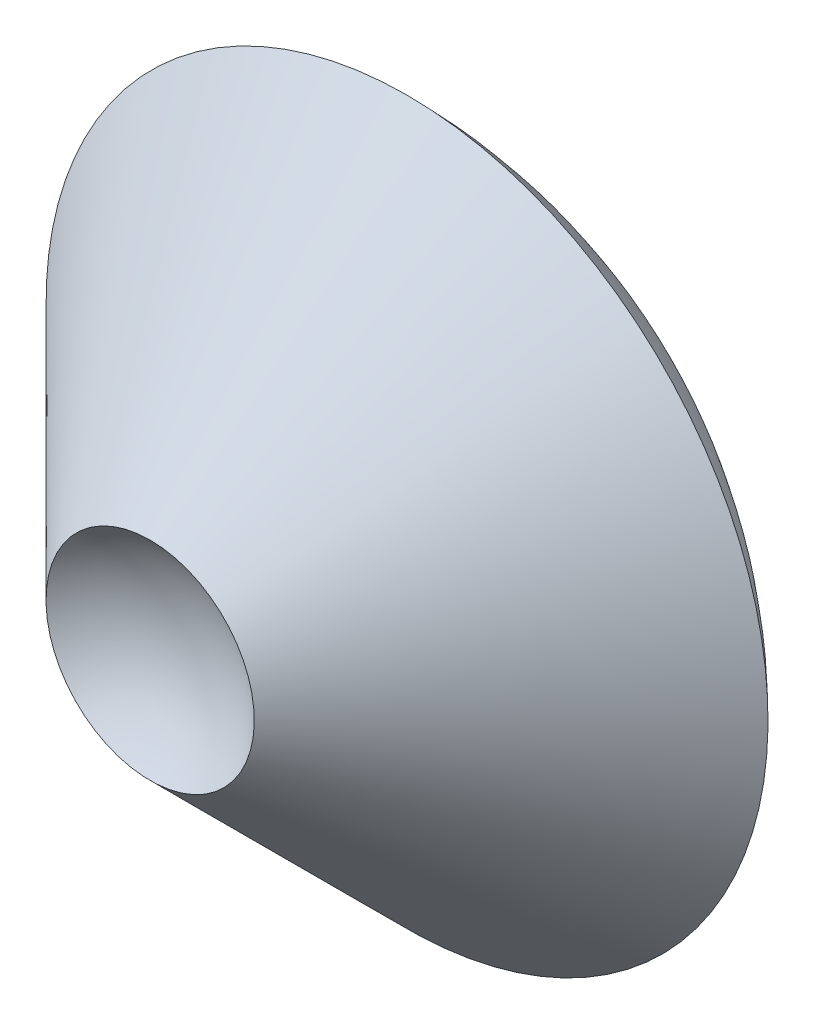
ISO-10303-21;
HEADER;
FILE_DESCRIPTION(('STEP AP214'),'2;1');
FILE_NAME('part.step','',(''),(''),'','','');
FILE_SCHEMA(('AUTOMOTIVE_DESIGN { 1 0 10303 214 1 1 1 1 }'));
ENDSEC;
DATA;
#1=APPLICATION_CONTEXT('core data for automotive mechanical design processes');
#2=APPLICATION_PROTOCOL_DEFINITION('international standard','automotive_design',2000,#1);
#3=PRODUCT_CONTEXT('',#1,'mechanical');
#4=PRODUCT('Part','Part','',(#3));
#5=PRODUCT_RELATED_PRODUCT_CATEGORY('part','',(#4));
#6=PRODUCT_DEFINITION_FORMATION('','',#4);
#7=PRODUCT_DEFINITION_CONTEXT('part definition',#1,'design');
#8=PRODUCT_DEFINITION('design','',#6,#7);
#9=PRODUCT_DEFINITION_SHAPE('','',#8);
#10=(LENGTH_UNIT() NAMED_UNIT(*) SI_UNIT(.MILLI.,.METRE.));
#11=(NAMED_UNIT(*) PLANE_ANGLE_UNIT() SI_UNIT($,.RADIAN.));
#12=(NAMED_UNIT(*) SI_UNIT($,.STERADIAN.) SOLID_ANGLE_UNIT());
#13=UNCERTAINTY_MEASURE_WITH_UNIT(LENGTH_MEASURE(1.E-05),#10,'distance_accuracy_value','');
#14=(GEOMETRIC_REPRESENTATION_CONTEXT(3) GLOBAL_UNCERTAINTY_ASSIGNED_CONTEXT((#13)) GLOBAL_UNIT_ASSIGNED_CONTEXT((#10,
#11,#12)) REPRESENTATION_CONTEXT('',''));
#15=CARTESIAN_POINT('',(0.,0.,0.));
#16=DIRECTION('',(0.,0.,1.));
#17=DIRECTION('',(1.,0.,0.));
#18=AXIS2_PLACEMENT_3D('',#15,#16,#17);
#19=CARTESIAN_POINT('',(0.,0.,0.));
#20=DIRECTION('',(0.,0.,-1.));
#21=DIRECTION('',(0.,1.,0.));
#22=AXIS2_PLACEMENT_3D('',#19,#20,#21);
#23=SPHERICAL_SURFACE('',#22,75.);
#24=CARTESIAN_POINT('',(0.,0.,-53.033008588991));
#25=DIRECTION('',(0.,0.,-1.));
#26=DIRECTION('',(0.,1.,0.));
#27=AXIS2_PLACEMENT_3D('',#24,#25,#26);
#28=CIRCLE('',#27,53.0330085889911);
#29=CARTESIAN_POINT('',(0.,53.0330085889911,-53.033008588991));
#30=VERTEX_POINT('',#29);
#31=EDGE_CURVE('E50',#30,#30,#28,.T.);
#32=ORIENTED_EDGE('',*,*,#31,.F.);
#33=EDGE_LOOP('',(#32));
#34=FACE_BOUND('',#33,.T.);
#35=ADVANCED_FACE('F44',(#34),#23,.F.);
#36=CARTESIAN_POINT('',(0.,0.,0.));
#37=DIRECTION('',(0.,0.,-1.));
#38=DIRECTION('',(0.,1.,0.));
#39=AXIS2_PLACEMENT_3D('',#36,#37,#38);
#40=SPHERICAL_SURFACE('',#39,260.);
#41=CARTESIAN_POINT('',(0.,0.,-183.847763108502));
#42=DIRECTION('',(0.,0.,-1.));
#43=DIRECTION('',(0.,1.,0.));
#44=AXIS2_PLACEMENT_3D('',#41,#42,#43);
#45=CIRCLE('',#44,183.847763108503);
#46=CARTESIAN_POINT('',(0.,183.847763108503,-183.847763108502));
#47=VERTEX_POINT('',#46);
#48=EDGE_CURVE('E12',#47,#47,#45,.T.);
#49=ORIENTED_EDGE('',*,*,#48,.T.);
#50=EDGE_LOOP('',(#49));
#51=FACE_BOUND('',#50,.T.);
#52=ADVANCED_FACE('F60',(#51),#40,.T.);
#53=CARTESIAN_POINT('',(0.,0.,-183.847763108502));
#54=DIRECTION('',(0.,0.,-1.));
#55=DIRECTION('',(0.,1.,0.));
#56=AXIS2_PLACEMENT_3D('',#53,#54,#55);
#57=CONICAL_SURFACE('',#56,183.847763108503,0.785398163397451);
#58=CARTESIAN_POINT('',(0.,53.0330085889911,-53.033008588991));
#59=CARTESIAN_POINT('',(0.,54.3956622819027,-54.3956622819026));
#60=CARTESIAN_POINT('',(0.,55.7583159748143,-55.7583159748141));
#61=CARTESIAN_POINT('',(0.,58.4836233606375,-58.4836233606373));
#62=CARTESIAN_POINT('',(0.,59.846277053549,-59.8462770535489));
#63=CARTESIAN_POINT('',(0.,62.5715844393722,-62.571584439372));
#64=CARTESIAN_POINT('',(0.,63.9342381322838,-63.9342381322836));
#65=CARTESIAN_POINT('',(0.,66.6595455181069,-66.6595455181067));
#66=CARTESIAN_POINT('',(0.,68.0221992110185,-68.0221992110183));
#67=CARTESIAN_POINT('',(0.,70.7475065968417,-70.7475065968414));
#68=CARTESIAN_POINT('',(0.,72.1101602897532,-72.110160289753));
#69=CARTESIAN_POINT('',(0.,74.8354676755764,-74.8354676755762));
#70=CARTESIAN_POINT('',(0.,76.198121368488,-76.1981213684877));
#71=CARTESIAN_POINT('',(0.,78.9234287543111,-78.9234287543109));
#72=CARTESIAN_POINT('',(0.,80.2860824472227,-80.2860824472225));
#73=CARTESIAN_POINT('',(0.,83.0113898330459,-83.0113898330456));
#74=CARTESIAN_POINT('',(0.,84.3740435259575,-84.3740435259572));
#75=CARTESIAN_POINT('',(0.,87.0993509117806,-87.0993509117803));
#76=CARTESIAN_POINT('',(0.,88.4620046046922,-88.4620046046919));
#77=CARTESIAN_POINT('',(0.,91.1873119905154,-91.187311990515));
#78=CARTESIAN_POINT('',(0.,92.5499656834269,-92.5499656834266));
#79=CARTESIAN_POINT('',(0.,95.2752730692501,-95.2752730692497));
#80=CARTESIAN_POINT('',(0.,96.6379267621617,-96.6379267621613));
#81=CARTESIAN_POINT('',(0.,99.3632341479848,-99.3632341479845));
#82=CARTESIAN_POINT('',(0.,100.725887840896,-100.725887840896));
#83=CARTESIAN_POINT('',(0.,103.45119522672,-103.451195226719));
#84=CARTESIAN_POINT('',(0.,104.813848919631,-104.813848919631));
#85=CARTESIAN_POINT('',(0.,107.539156305454,-107.539156305454));
#86=CARTESIAN_POINT('',(0.,108.901809998366,-108.901809998365));
#87=CARTESIAN_POINT('',(0.,111.627117384189,-111.627117384189));
#88=CARTESIAN_POINT('',(0.,112.989771077101,-112.9897710771));
#89=CARTESIAN_POINT('',(0.,115.715078462924,-115.715078462923));
#90=CARTESIAN_POINT('',(0.,117.077732155835,-117.077732155835));
#91=CARTESIAN_POINT('',(0.,119.803039541659,-119.803039541658));
#92=CARTESIAN_POINT('',(0.,121.16569323457,-121.16569323457));
#93=CARTESIAN_POINT('',(0.,123.891000620393,-123.891000620393));
#94=CARTESIAN_POINT('',(0.,125.253654313305,-125.253654313304));
#95=CARTESIAN_POINT('',(0.,127.978961699128,-127.978961699128));
#96=CARTESIAN_POINT('',(0.,129.34161539204,-129.341615392039));
#97=CARTESIAN_POINT('',(0.,132.066922777863,-132.066922777862));
#98=CARTESIAN_POINT('',(0.,133.429576470774,-133.429576470774));
#99=CARTESIAN_POINT('',(0.,136.154883856597,-136.154883856597));
#100=CARTESIAN_POINT('',(0.,137.517537549509,-137.517537549509));
#101=CARTESIAN_POINT('',(0.,140.242844935332,-140.242844935332));
#102=CARTESIAN_POINT('',(0.,141.605498628244,-141.605498628243));
#103=CARTESIAN_POINT('',(0.,144.330806014067,-144.330806014066));
#104=CARTESIAN_POINT('',(0.,145.693459706979,-145.693459706978));
#105=CARTESIAN_POINT('',(0.,148.418767092802,-148.418767092801));
#106=CARTESIAN_POINT('',(0.,149.781420785713,-149.781420785713));
#107=CARTESIAN_POINT('',(0.,152.506728171536,-152.506728171536));
#108=CARTESIAN_POINT('',(0.,153.869381864448,-153.869381864447));
#109=CARTESIAN_POINT('',(0.,156.594689250271,-156.594689250271));
#110=CARTESIAN_POINT('',(0.,157.957342943183,-157.957342943182));
#111=CARTESIAN_POINT('',(0.,160.682650329006,-160.682650329005));
#112=CARTESIAN_POINT('',(0.,162.045304021918,-162.045304021917));
#113=CARTESIAN_POINT('',(0.,164.770611407741,-164.77061140774));
#114=CARTESIAN_POINT('',(0.,166.133265100652,-166.133265100652));
#115=CARTESIAN_POINT('',(0.,168.858572486475,-168.858572486475));
#116=CARTESIAN_POINT('',(0.,170.221226179387,-170.221226179386));
#117=CARTESIAN_POINT('',(0.,172.94653356521,-172.946533565209));
#118=CARTESIAN_POINT('',(0.,174.309187258122,-174.309187258121));
#119=CARTESIAN_POINT('',(0.,177.034494643945,-177.034494643944));
#120=CARTESIAN_POINT('',(0.,178.397148336856,-178.397148336856));
#121=CARTESIAN_POINT('',(0.,181.12245572268,-181.122455722679));
#122=CARTESIAN_POINT('',(0.,182.485109415591,-182.48510941559));
#123=CARTESIAN_POINT('',(0.,183.847763108503,-183.847763108502));
#124=B_SPLINE_CURVE_WITH_KNOTS('',3,(#58,#59,#60,#61,#62,#63,#64,#65,#66,#67,#68,#69,#70,#71,
#72,#73,#74,#75,#76,#77,#78,#79,#80,#81,#82,#83,#84,#85,#86,#87,#88,#89,#90,#91,#92,#93,#94,#95,
#96,#97,#98,#99,#100,#101,#102,#103,#104,#105,#106,#107,#108,#109,#110,#111,#112,#113,#114,#115,
#116,#117,#118,#119,#120,#121,#122,#123),.UNSPECIFIED.,.F.,.F.,(4,2,2,2,2,2,2,2,2,2,2,2,2,2,2,2,
2,2,2,2,2,2,2,2,2,2,2,2,2,2,2,2,4),(0.,5.78125,11.5625,17.34375,23.125,28.90625,34.6875,
40.46875,46.25,52.03125,57.8125,63.59375,69.375,75.15625,80.9375,86.71875,92.5,98.28125,
104.0625,109.84375,115.625,121.40625,127.1875,132.96875,138.75,144.53125,150.3125,156.09375,
161.875,167.65625,173.4375,179.21875,185.),.UNSPECIFIED.);
#125=EDGE_CURVE('BSEAM56',#30,#47,#124,.T.);
#126=ORIENTED_EDGE('',*,*,#31,.T.);
#127=ORIENTED_EDGE('',*,*,#48,.F.);
#128=ORIENTED_EDGE('',*,*,#125,.T.);
#129=ORIENTED_EDGE('',*,*,#125,.F.);
#130=EDGE_LOOP('',(#126,#128,#127,#129));
#131=FACE_BOUND('',#130,.T.);
#132=ADVANCED_FACE('F56',(#131),#57,.T.);
#133=CLOSED_SHELL('',(#35,#52,#132));
#134=MANIFOLD_SOLID_BREP('B2',#133);
#135=ADVANCED_BREP_SHAPE_REPRESENTATION('',(#18,#134),#14);
#136=SHAPE_DEFINITION_REPRESENTATION(#9,#135);
ENDSEC;
END-ISO-10303-21;
